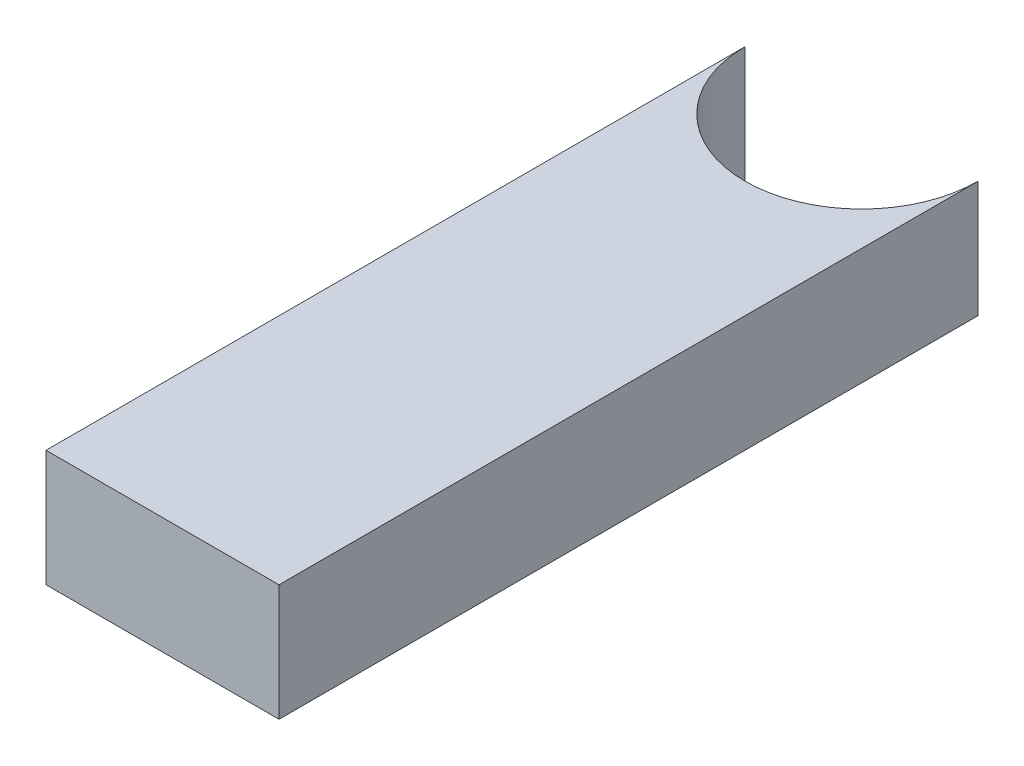
ISO-10303-21;
HEADER;
FILE_DESCRIPTION(('STEP AP214'),'2;1');
FILE_NAME('part.step','',(''),(''),'','','');
FILE_SCHEMA(('AUTOMOTIVE_DESIGN { 1 0 10303 214 1 1 1 1 }'));
ENDSEC;
DATA;
#1=APPLICATION_CONTEXT('core data for automotive mechanical design processes');
#2=APPLICATION_PROTOCOL_DEFINITION('international standard','automotive_design',2000,#1);
#3=PRODUCT_CONTEXT('',#1,'mechanical');
#4=PRODUCT('Part','Part','',(#3));
#5=PRODUCT_RELATED_PRODUCT_CATEGORY('part','',(#4));
#6=PRODUCT_DEFINITION_FORMATION('','',#4);
#7=PRODUCT_DEFINITION_CONTEXT('part definition',#1,'design');
#8=PRODUCT_DEFINITION('design','',#6,#7);
#9=PRODUCT_DEFINITION_SHAPE('','',#8);
#10=(LENGTH_UNIT() NAMED_UNIT(*) SI_UNIT(.MILLI.,.METRE.));
#11=(NAMED_UNIT(*) PLANE_ANGLE_UNIT() SI_UNIT($,.RADIAN.));
#12=(NAMED_UNIT(*) SI_UNIT($,.STERADIAN.) SOLID_ANGLE_UNIT());
#13=UNCERTAINTY_MEASURE_WITH_UNIT(LENGTH_MEASURE(1.E-05),#10,'distance_accuracy_value','');
#14=(GEOMETRIC_REPRESENTATION_CONTEXT(3) GLOBAL_UNCERTAINTY_ASSIGNED_CONTEXT((#13)) GLOBAL_UNIT_ASSIGNED_CONTEXT((#10,
#11,#12)) REPRESENTATION_CONTEXT('',''));
#15=CARTESIAN_POINT('',(0.,0.,0.));
#16=DIRECTION('',(0.,0.,1.));
#17=DIRECTION('',(1.,0.,0.));
#18=AXIS2_PLACEMENT_3D('',#15,#16,#17);
#19=CARTESIAN_POINT('',(2.54,2.54,-15.24));
#20=DIRECTION('',(0.,-1.,0.));
#21=DIRECTION('',(0.,0.,-1.));
#22=AXIS2_PLACEMENT_3D('',#19,#20,#21);
#23=CYLINDRICAL_SURFACE('',#22,2.54);
#24=CARTESIAN_POINT('',(2.54,0.,-15.24));
#25=DIRECTION('',(0.,-1.,0.));
#26=DIRECTION('',(0.,0.,-1.));
#27=AXIS2_PLACEMENT_3D('',#24,#25,#26);
#28=CIRCLE('',#27,2.54);
#29=CARTESIAN_POINT('',(5.08,0.,-15.24));
#30=VERTEX_POINT('',#29);
#31=CARTESIAN_POINT('',(0.,0.,-15.24));
#32=VERTEX_POINT('',#31);
#33=EDGE_CURVE('E95',#30,#32,#28,.T.);
#34=ORIENTED_EDGE('',*,*,#33,.T.);
#35=DIRECTION('',(0.,-1.,0.));
#36=VECTOR('',#35,1.);
#37=CARTESIAN_POINT('',(0.,2.54,-15.24));
#38=LINE('',#37,#36);
#39=CARTESIAN_POINT('',(0.,2.54,-15.24));
#40=VERTEX_POINT('',#39);
#41=EDGE_CURVE('E11',#40,#32,#38,.T.);
#42=ORIENTED_EDGE('',*,*,#41,.F.);
#43=CARTESIAN_POINT('',(2.54,2.54,-15.24));
#44=DIRECTION('',(0.,-1.,0.));
#45=DIRECTION('',(0.,0.,-1.));
#46=AXIS2_PLACEMENT_3D('',#43,#44,#45);
#47=CIRCLE('',#46,2.54);
#48=CARTESIAN_POINT('',(5.08,2.54,-15.24));
#49=VERTEX_POINT('',#48);
#50=EDGE_CURVE('E83',#49,#40,#47,.T.);
#51=ORIENTED_EDGE('',*,*,#50,.F.);
#52=DIRECTION('',(0.,-1.,0.));
#53=VECTOR('',#52,1.);
#54=CARTESIAN_POINT('',(5.08,2.54,-15.24));
#55=LINE('',#54,#53);
#56=EDGE_CURVE('E91',#49,#30,#55,.T.);
#57=ORIENTED_EDGE('',*,*,#56,.T.);
#58=EDGE_LOOP('',(#34,#42,#51,#57));
#59=FACE_BOUND('',#58,.T.);
#60=ADVANCED_FACE('F32',(#59),#23,.F.);
#61=CARTESIAN_POINT('',(0.,2.54,-15.24));
#62=DIRECTION('',(1.,0.,0.));
#63=DIRECTION('',(0.,0.,-1.));
#64=AXIS2_PLACEMENT_3D('',#61,#62,#63);
#65=PLANE('',#64);
#66=DIRECTION('',(0.,0.,1.));
#67=VECTOR('',#66,1.);
#68=CARTESIAN_POINT('',(0.,0.,-15.24));
#69=LINE('',#68,#67);
#70=CARTESIAN_POINT('',(0.,0.,0.));
#71=VERTEX_POINT('',#70);
#72=EDGE_CURVE('E87',#32,#71,#69,.T.);
#73=ORIENTED_EDGE('',*,*,#72,.T.);
#74=DIRECTION('',(0.,-1.,0.));
#75=VECTOR('',#74,1.);
#76=CARTESIAN_POINT('',(0.,2.54,0.));
#77=LINE('',#76,#75);
#78=CARTESIAN_POINT('',(0.,2.54,0.));
#79=VERTEX_POINT('',#78);
#80=EDGE_CURVE('E40',#79,#71,#77,.T.);
#81=ORIENTED_EDGE('',*,*,#80,.F.);
#82=DIRECTION('',(0.,0.,1.));
#83=VECTOR('',#82,1.);
#84=CARTESIAN_POINT('',(0.,2.54,-15.24));
#85=LINE('',#84,#83);
#86=EDGE_CURVE('E78',#40,#79,#85,.T.);
#87=ORIENTED_EDGE('',*,*,#86,.F.);
#88=ORIENTED_EDGE('',*,*,#41,.T.);
#89=EDGE_LOOP('',(#73,#81,#87,#88));
#90=FACE_BOUND('',#89,.T.);
#91=ADVANCED_FACE('F86',(#90),#65,.F.);
#92=CARTESIAN_POINT('',(0.,2.54,0.));
#93=DIRECTION('',(0.,0.,-1.));
#94=DIRECTION('',(-1.,0.,0.));
#95=AXIS2_PLACEMENT_3D('',#92,#93,#94);
#96=PLANE('',#95);
#97=DIRECTION('',(1.,0.,0.));
#98=VECTOR('',#97,1.);
#99=CARTESIAN_POINT('',(0.,0.,0.));
#100=LINE('',#99,#98);
#101=CARTESIAN_POINT('',(5.08,0.,0.));
#102=VERTEX_POINT('',#101);
#103=EDGE_CURVE('E65',#71,#102,#100,.T.);
#104=ORIENTED_EDGE('',*,*,#103,.T.);
#105=DIRECTION('',(0.,-1.,0.));
#106=VECTOR('',#105,1.);
#107=CARTESIAN_POINT('',(5.08,2.54,0.));
#108=LINE('',#107,#106);
#109=CARTESIAN_POINT('',(5.08,2.54,0.));
#110=VERTEX_POINT('',#109);
#111=EDGE_CURVE('E88',#110,#102,#108,.T.);
#112=ORIENTED_EDGE('',*,*,#111,.F.);
#113=DIRECTION('',(1.,0.,0.));
#114=VECTOR('',#113,1.);
#115=CARTESIAN_POINT('',(0.,2.54,0.));
#116=LINE('',#115,#114);
#117=EDGE_CURVE('E81',#79,#110,#116,.T.);
#118=ORIENTED_EDGE('',*,*,#117,.F.);
#119=ORIENTED_EDGE('',*,*,#80,.T.);
#120=EDGE_LOOP('',(#104,#112,#118,#119));
#121=FACE_BOUND('',#120,.T.);
#122=ADVANCED_FACE('F89',(#121),#96,.F.);
#123=CARTESIAN_POINT('',(5.08,2.54,0.));
#124=DIRECTION('',(-1.,0.,0.));
#125=DIRECTION('',(0.,0.,1.));
#126=AXIS2_PLACEMENT_3D('',#123,#124,#125);
#127=PLANE('',#126);
#128=DIRECTION('',(0.,0.,-1.));
#129=VECTOR('',#128,1.);
#130=CARTESIAN_POINT('',(5.08,0.,0.));
#131=LINE('',#130,#129);
#132=EDGE_CURVE('E71',#102,#30,#131,.T.);
#133=ORIENTED_EDGE('',*,*,#132,.T.);
#134=ORIENTED_EDGE('',*,*,#56,.F.);
#135=DIRECTION('',(0.,0.,-1.));
#136=VECTOR('',#135,1.);
#137=CARTESIAN_POINT('',(5.08,2.54,0.));
#138=LINE('',#137,#136);
#139=EDGE_CURVE('E48',#110,#49,#138,.T.);
#140=ORIENTED_EDGE('',*,*,#139,.F.);
#141=ORIENTED_EDGE('',*,*,#111,.T.);
#142=EDGE_LOOP('',(#133,#134,#140,#141));
#143=FACE_BOUND('',#142,.T.);
#144=ADVANCED_FACE('F102',(#143),#127,.F.);
#145=CARTESIAN_POINT('',(2.54,2.54,-15.24));
#146=DIRECTION('',(0.,-1.,0.));
#147=DIRECTION('',(0.,0.,-1.));
#148=AXIS2_PLACEMENT_3D('',#145,#146,#147);
#149=PLANE('',#148);
#150=ORIENTED_EDGE('',*,*,#50,.T.);
#151=ORIENTED_EDGE('',*,*,#86,.T.);
#152=ORIENTED_EDGE('',*,*,#117,.T.);
#153=ORIENTED_EDGE('',*,*,#139,.T.);
#154=EDGE_LOOP('',(#150,#151,#152,#153));
#155=FACE_BOUND('',#154,.T.);
#156=ADVANCED_FACE('F79',(#155),#149,.F.);
#157=CARTESIAN_POINT('',(2.54,0.,-15.24));
#158=DIRECTION('',(0.,-1.,0.));
#159=DIRECTION('',(0.,0.,-1.));
#160=AXIS2_PLACEMENT_3D('',#157,#158,#159);
#161=PLANE('',#160);
#162=ORIENTED_EDGE('',*,*,#33,.F.);
#163=ORIENTED_EDGE('',*,*,#132,.F.);
#164=ORIENTED_EDGE('',*,*,#103,.F.);
#165=ORIENTED_EDGE('',*,*,#72,.F.);
#166=EDGE_LOOP('',(#162,#163,#164,#165));
#167=FACE_BOUND('',#166,.T.);
#168=ADVANCED_FACE('F105',(#167),#161,.T.);
#169=CLOSED_SHELL('',(#60,#91,#122,#144,#156,#168));
#170=MANIFOLD_SOLID_BREP('B2',#169);
#171=ADVANCED_BREP_SHAPE_REPRESENTATION('',(#18,#170),#14);
#172=SHAPE_DEFINITION_REPRESENTATION(#9,#171);
ENDSEC;
END-ISO-10303-21;
